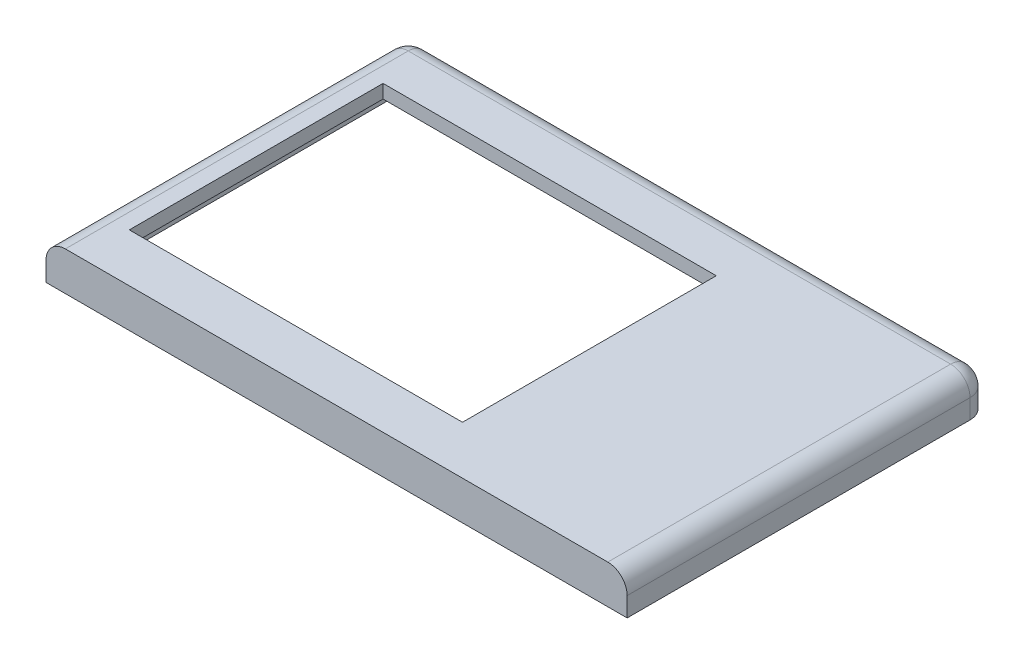
ISO-10303-21;
HEADER;
FILE_DESCRIPTION(('STEP AP214'),'2;1');
FILE_NAME('part.step','',(''),(''),'','','');
FILE_SCHEMA(('AUTOMOTIVE_DESIGN { 1 0 10303 214 1 1 1 1 }'));
ENDSEC;
DATA;
#1=APPLICATION_CONTEXT('core data for automotive mechanical design processes');
#2=APPLICATION_PROTOCOL_DEFINITION('international standard','automotive_design',2000,#1);
#3=PRODUCT_CONTEXT('',#1,'mechanical');
#4=PRODUCT('Part','Part','',(#3));
#5=PRODUCT_RELATED_PRODUCT_CATEGORY('part','',(#4));
#6=PRODUCT_DEFINITION_FORMATION('','',#4);
#7=PRODUCT_DEFINITION_CONTEXT('part definition',#1,'design');
#8=PRODUCT_DEFINITION('design','',#6,#7);
#9=PRODUCT_DEFINITION_SHAPE('','',#8);
#10=(LENGTH_UNIT() NAMED_UNIT(*) SI_UNIT(.MILLI.,.METRE.));
#11=(NAMED_UNIT(*) PLANE_ANGLE_UNIT() SI_UNIT($,.RADIAN.));
#12=(NAMED_UNIT(*) SI_UNIT($,.STERADIAN.) SOLID_ANGLE_UNIT());
#13=UNCERTAINTY_MEASURE_WITH_UNIT(LENGTH_MEASURE(1.E-05),#10,'distance_accuracy_value','');
#14=(GEOMETRIC_REPRESENTATION_CONTEXT(3) GLOBAL_UNCERTAINTY_ASSIGNED_CONTEXT((#13)) GLOBAL_UNIT_ASSIGNED_CONTEXT((#10,
#11,#12)) REPRESENTATION_CONTEXT('',''));
#15=CARTESIAN_POINT('',(0.,0.,0.));
#16=DIRECTION('',(0.,0.,1.));
#17=DIRECTION('',(1.,0.,0.));
#18=AXIS2_PLACEMENT_3D('',#15,#16,#17);
#19=CARTESIAN_POINT('',(0.,0.,0.));
#20=DIRECTION('',(0.,-1.,0.));
#21=DIRECTION('',(0.,0.,-1.));
#22=AXIS2_PLACEMENT_3D('',#19,#20,#21);
#23=PLANE('',#22);
#24=DIRECTION('',(1.,0.,0.));
#25=VECTOR('',#24,1.);
#26=CARTESIAN_POINT('',(-78.2626785631851,0.,-31.9813008786177));
#27=LINE('',#26,#25);
#28=CARTESIAN_POINT('',(-68.2626785631851,0.,-31.9813008786177));
#29=VERTEX_POINT('',#28);
#30=CARTESIAN_POINT('',(211.737321436815,0.,-31.9813008786177));
#31=VERTEX_POINT('',#30);
#32=EDGE_CURVE('E258',#29,#31,#27,.T.);
#33=ORIENTED_EDGE('',*,*,#32,.T.);
#34=CARTESIAN_POINT('',(211.737321436815,0.,-21.9813008786177));
#35=DIRECTION('',(0.,-1.,0.));
#36=DIRECTION('',(0.,0.,-1.));
#37=AXIS2_PLACEMENT_3D('',#34,#35,#36);
#38=CIRCLE('',#37,10.);
#39=CARTESIAN_POINT('',(221.737321436815,0.,-21.9813008786177));
#40=VERTEX_POINT('',#39);
#41=EDGE_CURVE('E288',#31,#40,#38,.T.);
#42=ORIENTED_EDGE('',*,*,#41,.T.);
#43=DIRECTION('',(0.,0.,1.));
#44=VECTOR('',#43,1.);
#45=CARTESIAN_POINT('',(221.737321436815,0.,-31.9813008786177));
#46=LINE('',#45,#44);
#47=CARTESIAN_POINT('',(221.737321436815,0.,155.018699121382));
#48=VERTEX_POINT('',#47);
#49=EDGE_CURVE('E256',#40,#48,#46,.T.);
#50=ORIENTED_EDGE('',*,*,#49,.T.);
#51=DIRECTION('',(1.,0.,0.));
#52=VECTOR('',#51,1.);
#53=CARTESIAN_POINT('',(-78.2626785631851,0.,155.018699121382));
#54=LINE('',#53,#52);
#55=CARTESIAN_POINT('',(-78.2626785631851,0.,155.018699121382));
#56=VERTEX_POINT('',#55);
#57=EDGE_CURVE('E233',#56,#48,#54,.T.);
#58=ORIENTED_EDGE('',*,*,#57,.F.);
#59=DIRECTION('',(0.,0.,1.));
#60=VECTOR('',#59,1.);
#61=CARTESIAN_POINT('',(-78.2626785631851,0.,-31.9813008786177));
#62=LINE('',#61,#60);
#63=CARTESIAN_POINT('',(-78.2626785631851,0.,-21.9813008786177));
#64=VERTEX_POINT('',#63);
#65=EDGE_CURVE('E253',#64,#56,#62,.T.);
#66=ORIENTED_EDGE('',*,*,#65,.F.);
#67=CARTESIAN_POINT('',(-68.2626785631851,0.,-21.9813008786177));
#68=DIRECTION('',(0.,-1.,0.));
#69=DIRECTION('',(0.,0.,-1.));
#70=AXIS2_PLACEMENT_3D('',#67,#68,#69);
#71=CIRCLE('',#70,10.);
#72=EDGE_CURVE('E286',#64,#29,#71,.T.);
#73=ORIENTED_EDGE('',*,*,#72,.T.);
#74=EDGE_LOOP('',(#33,#42,#50,#58,#66,#73));
#75=FACE_BOUND('',#74,.T.);
#76=DIRECTION('',(0.,0.,1.));
#77=VECTOR('',#76,1.);
#78=CARTESIAN_POINT('',(-71.2626785631851,0.,0.));
#79=LINE('',#78,#77);
#80=CARTESIAN_POINT('',(-71.2626785631851,0.,-24.9813008786177));
#81=VERTEX_POINT('',#80);
#82=CARTESIAN_POINT('',(-71.2626785631851,0.,148.018699121382));
#83=VERTEX_POINT('',#82);
#84=EDGE_CURVE('E217',#81,#83,#79,.T.);
#85=ORIENTED_EDGE('',*,*,#84,.T.);
#86=DIRECTION('',(1.,0.,0.));
#87=VECTOR('',#86,1.);
#88=CARTESIAN_POINT('',(0.,0.,148.018699121382));
#89=LINE('',#88,#87);
#90=CARTESIAN_POINT('',(214.737321436815,0.,148.018699121382));
#91=VERTEX_POINT('',#90);
#92=EDGE_CURVE('E201',#83,#91,#89,.T.);
#93=ORIENTED_EDGE('',*,*,#92,.T.);
#94=DIRECTION('',(0.,0.,1.));
#95=VECTOR('',#94,1.);
#96=CARTESIAN_POINT('',(214.737321436815,0.,0.));
#97=LINE('',#96,#95);
#98=CARTESIAN_POINT('',(214.737321436815,0.,-24.9813008786177));
#99=VERTEX_POINT('',#98);
#100=EDGE_CURVE('E242',#99,#91,#97,.T.);
#101=ORIENTED_EDGE('',*,*,#100,.F.);
#102=DIRECTION('',(1.,0.,0.));
#103=VECTOR('',#102,1.);
#104=CARTESIAN_POINT('',(0.,0.,-24.9813008786177));
#105=LINE('',#104,#103);
#106=EDGE_CURVE('E245',#81,#99,#105,.T.);
#107=ORIENTED_EDGE('',*,*,#106,.F.);
#108=EDGE_LOOP('',(#85,#93,#101,#107));
#109=FACE_BOUND('',#108,.T.);
#110=ADVANCED_FACE('F35',(#75,#109),#23,.T.);
#111=CARTESIAN_POINT('',(-78.2626785631851,20.,155.018699121382));
#112=DIRECTION('',(0.,0.,-1.));
#113=DIRECTION('',(-1.,0.,0.));
#114=AXIS2_PLACEMENT_3D('',#111,#112,#113);
#115=PLANE('',#114);
#116=DIRECTION('',(0.,-1.,0.));
#117=VECTOR('',#116,1.);
#118=CARTESIAN_POINT('',(221.737321436815,20.,155.018699121382));
#119=LINE('',#118,#117);
#120=CARTESIAN_POINT('',(221.737321436815,10.,155.018699121382));
#121=VERTEX_POINT('',#120);
#122=EDGE_CURVE('E264',#121,#48,#119,.T.);
#123=ORIENTED_EDGE('',*,*,#122,.F.);
#124=CARTESIAN_POINT('',(211.737321436815,10.,155.018699121382));
#125=DIRECTION('',(0.,0.,-1.));
#126=DIRECTION('',(-1.,0.,0.));
#127=AXIS2_PLACEMENT_3D('',#124,#125,#126);
#128=CIRCLE('',#127,10.);
#129=CARTESIAN_POINT('',(211.737321436815,20.,155.018699121382));
#130=VERTEX_POINT('',#129);
#131=EDGE_CURVE('E275',#121,#130,#128,.F.);
#132=ORIENTED_EDGE('',*,*,#131,.T.);
#133=DIRECTION('',(1.,0.,0.));
#134=VECTOR('',#133,1.);
#135=CARTESIAN_POINT('',(-78.2626785631851,20.,155.018699121382));
#136=LINE('',#135,#134);
#137=CARTESIAN_POINT('',(-68.2626785631851,20.,155.018699121382));
#138=VERTEX_POINT('',#137);
#139=EDGE_CURVE('E249',#138,#130,#136,.T.);
#140=ORIENTED_EDGE('',*,*,#139,.F.);
#141=CARTESIAN_POINT('',(-68.2626785631851,10.,155.018699121382));
#142=DIRECTION('',(0.,0.,-1.));
#143=DIRECTION('',(-1.,0.,0.));
#144=AXIS2_PLACEMENT_3D('',#141,#142,#143);
#145=CIRCLE('',#144,10.);
#146=CARTESIAN_POINT('',(-78.2626785631851,10.,155.018699121382));
#147=VERTEX_POINT('',#146);
#148=EDGE_CURVE('E269',#138,#147,#145,.F.);
#149=ORIENTED_EDGE('',*,*,#148,.T.);
#150=DIRECTION('',(0.,-1.,0.));
#151=VECTOR('',#150,1.);
#152=CARTESIAN_POINT('',(-78.2626785631851,20.,155.018699121382));
#153=LINE('',#152,#151);
#154=EDGE_CURVE('E252',#147,#56,#153,.T.);
#155=ORIENTED_EDGE('',*,*,#154,.T.);
#156=ORIENTED_EDGE('',*,*,#57,.T.);
#157=EDGE_LOOP('',(#123,#132,#140,#149,#155,#156));
#158=FACE_BOUND('',#157,.T.);
#159=ADVANCED_FACE('F325',(#158),#115,.F.);
#160=CARTESIAN_POINT('',(221.737321436815,20.,-31.9813008786177));
#161=DIRECTION('',(1.,0.,0.));
#162=DIRECTION('',(0.,0.,-1.));
#163=AXIS2_PLACEMENT_3D('',#160,#161,#162);
#164=PLANE('',#163);
#165=ORIENTED_EDGE('',*,*,#49,.F.);
#166=DIRECTION('',(0.,-1.,0.));
#167=VECTOR('',#166,1.);
#168=CARTESIAN_POINT('',(221.737321436815,20.,-21.9813008786177));
#169=LINE('',#168,#167);
#170=CARTESIAN_POINT('',(221.737321436815,10.,-21.9813008786177));
#171=VERTEX_POINT('',#170);
#172=EDGE_CURVE('E290',#40,#171,#169,.F.);
#173=ORIENTED_EDGE('',*,*,#172,.T.);
#174=DIRECTION('',(0.,0.,1.));
#175=VECTOR('',#174,1.);
#176=CARTESIAN_POINT('',(221.737321436815,10.,155.018699121382));
#177=LINE('',#176,#175);
#178=EDGE_CURVE('E273',#171,#121,#177,.T.);
#179=ORIENTED_EDGE('',*,*,#178,.T.);
#180=ORIENTED_EDGE('',*,*,#122,.T.);
#181=EDGE_LOOP('',(#165,#173,#179,#180));
#182=FACE_BOUND('',#181,.T.);
#183=ADVANCED_FACE('F347',(#182),#164,.T.);
#184=CARTESIAN_POINT('',(-78.2626785631851,20.,-31.9813008786177));
#185=DIRECTION('',(0.,0.,-1.));
#186=DIRECTION('',(-1.,0.,0.));
#187=AXIS2_PLACEMENT_3D('',#184,#185,#186);
#188=PLANE('',#187);
#189=DIRECTION('',(1.,0.,0.));
#190=VECTOR('',#189,1.);
#191=CARTESIAN_POINT('',(211.737321436815,10.,-31.9813008786177));
#192=LINE('',#191,#190);
#193=CARTESIAN_POINT('',(-68.2626785631851,10.,-31.9813008786177));
#194=VERTEX_POINT('',#193);
#195=CARTESIAN_POINT('',(211.737321436815,10.,-31.9813008786177));
#196=VERTEX_POINT('',#195);
#197=EDGE_CURVE('E281',#194,#196,#192,.T.);
#198=ORIENTED_EDGE('',*,*,#197,.T.);
#199=DIRECTION('',(0.,-1.,0.));
#200=VECTOR('',#199,1.);
#201=CARTESIAN_POINT('',(211.737321436815,20.,-31.9813008786177));
#202=LINE('',#201,#200);
#203=EDGE_CURVE('E283',#196,#31,#202,.T.);
#204=ORIENTED_EDGE('',*,*,#203,.T.);
#205=ORIENTED_EDGE('',*,*,#32,.F.);
#206=DIRECTION('',(0.,-1.,0.));
#207=VECTOR('',#206,1.);
#208=CARTESIAN_POINT('',(-68.2626785631851,10.,-31.9813008786177));
#209=LINE('',#208,#207);
#210=EDGE_CURVE('E279',#29,#194,#209,.F.);
#211=ORIENTED_EDGE('',*,*,#210,.T.);
#212=EDGE_LOOP('',(#198,#204,#205,#211));
#213=FACE_BOUND('',#212,.T.);
#214=ADVANCED_FACE('F345',(#213),#188,.T.);
#215=CARTESIAN_POINT('',(-78.2626785631851,20.,-31.9813008786177));
#216=DIRECTION('',(1.,0.,0.));
#217=DIRECTION('',(0.,0.,-1.));
#218=AXIS2_PLACEMENT_3D('',#215,#216,#217);
#219=PLANE('',#218);
#220=DIRECTION('',(0.,0.,1.));
#221=VECTOR('',#220,1.);
#222=CARTESIAN_POINT('',(-78.2626785631851,10.,-31.9813008786177));
#223=LINE('',#222,#221);
#224=CARTESIAN_POINT('',(-78.2626785631851,10.,-21.9813008786177));
#225=VERTEX_POINT('',#224);
#226=EDGE_CURVE('E271',#147,#225,#223,.F.);
#227=ORIENTED_EDGE('',*,*,#226,.T.);
#228=DIRECTION('',(0.,-1.,0.));
#229=VECTOR('',#228,1.);
#230=CARTESIAN_POINT('',(-78.2626785631851,0.,-21.9813008786177));
#231=LINE('',#230,#229);
#232=EDGE_CURVE('E11',#225,#64,#231,.T.);
#233=ORIENTED_EDGE('',*,*,#232,.T.);
#234=ORIENTED_EDGE('',*,*,#65,.T.);
#235=ORIENTED_EDGE('',*,*,#154,.F.);
#236=EDGE_LOOP('',(#227,#233,#234,#235));
#237=FACE_BOUND('',#236,.T.);
#238=ADVANCED_FACE('F316',(#237),#219,.F.);
#239=CARTESIAN_POINT('',(0.,20.,0.));
#240=DIRECTION('',(0.,-1.,0.));
#241=DIRECTION('',(0.,0.,-1.));
#242=AXIS2_PLACEMENT_3D('',#239,#240,#241);
#243=PLANE('',#242);
#244=DIRECTION('',(1.,0.,0.));
#245=VECTOR('',#244,1.);
#246=CARTESIAN_POINT('',(-60.2626785631851,20.,130.018699121382));
#247=LINE('',#246,#245);
#248=CARTESIAN_POINT('',(-60.2626785631851,20.,130.018699121382));
#249=VERTEX_POINT('',#248);
#250=CARTESIAN_POINT('',(111.737321436815,20.,130.018699121382));
#251=VERTEX_POINT('',#250);
#252=EDGE_CURVE('E195',#249,#251,#247,.T.);
#253=ORIENTED_EDGE('',*,*,#252,.F.);
#254=DIRECTION('',(0.,0.,1.));
#255=VECTOR('',#254,1.);
#256=CARTESIAN_POINT('',(-60.2626785631851,20.,-0.981300878617704));
#257=LINE('',#256,#255);
#258=CARTESIAN_POINT('',(-60.2626785631851,20.,-0.981300878617704));
#259=VERTEX_POINT('',#258);
#260=EDGE_CURVE('E169',#259,#249,#257,.T.);
#261=ORIENTED_EDGE('',*,*,#260,.F.);
#262=DIRECTION('',(1.,0.,0.));
#263=VECTOR('',#262,1.);
#264=CARTESIAN_POINT('',(-60.2626785631851,20.,-0.981300878617704));
#265=LINE('',#264,#263);
#266=CARTESIAN_POINT('',(111.737321436815,20.,-0.981300878617704));
#267=VERTEX_POINT('',#266);
#268=EDGE_CURVE('E186',#259,#267,#265,.T.);
#269=ORIENTED_EDGE('',*,*,#268,.T.);
#270=DIRECTION('',(0.,0.,1.));
#271=VECTOR('',#270,1.);
#272=CARTESIAN_POINT('',(111.737321436815,20.,-0.981300878617704));
#273=LINE('',#272,#271);
#274=EDGE_CURVE('E189',#267,#251,#273,.T.);
#275=ORIENTED_EDGE('',*,*,#274,.T.);
#276=EDGE_LOOP('',(#253,#261,#269,#275));
#277=FACE_BOUND('',#276,.T.);
#278=DIRECTION('',(0.,0.,1.));
#279=VECTOR('',#278,1.);
#280=CARTESIAN_POINT('',(211.737321436815,20.,-31.9813008786177));
#281=LINE('',#280,#279);
#282=CARTESIAN_POINT('',(211.737321436815,20.,-21.9813008786177));
#283=VERTEX_POINT('',#282);
#284=EDGE_CURVE('E277',#130,#283,#281,.F.);
#285=ORIENTED_EDGE('',*,*,#284,.T.);
#286=DIRECTION('',(1.,0.,0.));
#287=VECTOR('',#286,1.);
#288=CARTESIAN_POINT('',(-68.2626785631851,20.,-21.9813008786177));
#289=LINE('',#288,#287);
#290=CARTESIAN_POINT('',(-68.2626785631851,20.,-21.9813008786177));
#291=VERTEX_POINT('',#290);
#292=EDGE_CURVE('E59',#283,#291,#289,.F.);
#293=ORIENTED_EDGE('',*,*,#292,.T.);
#294=DIRECTION('',(0.,0.,1.));
#295=VECTOR('',#294,1.);
#296=CARTESIAN_POINT('',(-68.2626785631851,20.,0.));
#297=LINE('',#296,#295);
#298=EDGE_CURVE('E267',#291,#138,#297,.T.);
#299=ORIENTED_EDGE('',*,*,#298,.T.);
#300=ORIENTED_EDGE('',*,*,#139,.T.);
#301=EDGE_LOOP('',(#285,#293,#299,#300));
#302=FACE_BOUND('',#301,.T.);
#303=ADVANCED_FACE('F331',(#277,#302),#243,.F.);
#304=CARTESIAN_POINT('',(-68.2626785631851,10.,0.));
#305=DIRECTION('',(0.,0.,1.));
#306=DIRECTION('',(1.,0.,0.));
#307=AXIS2_PLACEMENT_3D('',#304,#305,#306);
#308=CYLINDRICAL_SURFACE('',#307,10.);
#309=ORIENTED_EDGE('',*,*,#298,.F.);
#310=CARTESIAN_POINT('',(-68.2626785631851,10.,-21.9813008786177));
#311=DIRECTION('',(0.,0.,1.));
#312=DIRECTION('',(1.,0.,0.));
#313=AXIS2_PLACEMENT_3D('',#310,#311,#312);
#314=CIRCLE('',#313,10.);
#315=EDGE_CURVE('E44',#291,#225,#314,.T.);
#316=ORIENTED_EDGE('',*,*,#315,.T.);
#317=ORIENTED_EDGE('',*,*,#226,.F.);
#318=ORIENTED_EDGE('',*,*,#148,.F.);
#319=EDGE_LOOP('',(#309,#316,#317,#318));
#320=FACE_BOUND('',#319,.T.);
#321=ADVANCED_FACE('F328',(#320),#308,.T.);
#322=CARTESIAN_POINT('',(211.737321436815,10.,-31.9813008786177));
#323=DIRECTION('',(0.,0.,-1.));
#324=DIRECTION('',(-1.,0.,0.));
#325=AXIS2_PLACEMENT_3D('',#322,#323,#324);
#326=CYLINDRICAL_SURFACE('',#325,10.);
#327=ORIENTED_EDGE('',*,*,#178,.F.);
#328=CARTESIAN_POINT('',(211.737321436815,10.,-21.9813008786177));
#329=DIRECTION('',(0.,0.,-1.));
#330=DIRECTION('',(-1.,0.,0.));
#331=AXIS2_PLACEMENT_3D('',#328,#329,#330);
#332=CIRCLE('',#331,10.);
#333=EDGE_CURVE('E292',#171,#283,#332,.F.);
#334=ORIENTED_EDGE('',*,*,#333,.T.);
#335=ORIENTED_EDGE('',*,*,#284,.F.);
#336=ORIENTED_EDGE('',*,*,#131,.F.);
#337=EDGE_LOOP('',(#327,#334,#335,#336));
#338=FACE_BOUND('',#337,.T.);
#339=ADVANCED_FACE('F334',(#338),#326,.T.);
#340=CARTESIAN_POINT('',(-78.2626785631851,20.,148.018699121382));
#341=DIRECTION('',(0.,0.,-1.));
#342=DIRECTION('',(-1.,0.,0.));
#343=AXIS2_PLACEMENT_3D('',#340,#341,#342);
#344=PLANE('',#343);
#345=DIRECTION('',(0.,-1.,0.));
#346=VECTOR('',#345,1.);
#347=CARTESIAN_POINT('',(214.737321436815,20.,148.018699121382));
#348=LINE('',#347,#346);
#349=CARTESIAN_POINT('',(214.737321436815,10.,148.018699121382));
#350=VERTEX_POINT('',#349);
#351=EDGE_CURVE('E205',#350,#91,#348,.T.);
#352=ORIENTED_EDGE('',*,*,#351,.T.);
#353=ORIENTED_EDGE('',*,*,#92,.F.);
#354=DIRECTION('',(0.,-1.,0.));
#355=VECTOR('',#354,1.);
#356=CARTESIAN_POINT('',(-71.2626785631851,20.,148.018699121382));
#357=LINE('',#356,#355);
#358=CARTESIAN_POINT('',(-71.2626785631851,10.,148.018699121382));
#359=VERTEX_POINT('',#358);
#360=EDGE_CURVE('E221',#359,#83,#357,.T.);
#361=ORIENTED_EDGE('',*,*,#360,.F.);
#362=CARTESIAN_POINT('',(-68.2626785631851,10.,148.018699121382));
#363=DIRECTION('',(0.,0.,-1.));
#364=DIRECTION('',(-1.,0.,0.));
#365=AXIS2_PLACEMENT_3D('',#362,#363,#364);
#366=CIRCLE('',#365,3.);
#367=CARTESIAN_POINT('',(-68.2626785631851,13.,148.018699121382));
#368=VERTEX_POINT('',#367);
#369=EDGE_CURVE('E218',#368,#359,#366,.F.);
#370=ORIENTED_EDGE('',*,*,#369,.F.);
#371=DIRECTION('',(1.,0.,0.));
#372=VECTOR('',#371,1.);
#373=CARTESIAN_POINT('',(0.,13.,148.018699121382));
#374=LINE('',#373,#372);
#375=CARTESIAN_POINT('',(211.737321436815,13.,148.018699121382));
#376=VERTEX_POINT('',#375);
#377=EDGE_CURVE('E213',#368,#376,#374,.T.);
#378=ORIENTED_EDGE('',*,*,#377,.T.);
#379=CARTESIAN_POINT('',(211.737321436815,10.,148.018699121382));
#380=DIRECTION('',(0.,0.,-1.));
#381=DIRECTION('',(-1.,0.,0.));
#382=AXIS2_PLACEMENT_3D('',#379,#380,#381);
#383=CIRCLE('',#382,3.);
#384=EDGE_CURVE('E209',#350,#376,#383,.F.);
#385=ORIENTED_EDGE('',*,*,#384,.F.);
#386=EDGE_LOOP('',(#352,#353,#361,#370,#378,#385));
#387=FACE_BOUND('',#386,.T.);
#388=ADVANCED_FACE('F392',(#387),#344,.T.);
#389=CARTESIAN_POINT('',(214.737321436815,20.,-31.9813008786177));
#390=DIRECTION('',(1.,0.,0.));
#391=DIRECTION('',(0.,0.,-1.));
#392=AXIS2_PLACEMENT_3D('',#389,#390,#391);
#393=PLANE('',#392);
#394=DIRECTION('',(0.,-1.,0.));
#395=VECTOR('',#394,1.);
#396=CARTESIAN_POINT('',(214.737321436815,20.,-24.9813008786177));
#397=LINE('',#396,#395);
#398=CARTESIAN_POINT('',(214.737321436815,10.,-24.9813008786177));
#399=VERTEX_POINT('',#398);
#400=EDGE_CURVE('E208',#399,#99,#397,.T.);
#401=ORIENTED_EDGE('',*,*,#400,.T.);
#402=ORIENTED_EDGE('',*,*,#100,.T.);
#403=ORIENTED_EDGE('',*,*,#351,.F.);
#404=DIRECTION('',(0.,0.,-1.));
#405=VECTOR('',#404,1.);
#406=CARTESIAN_POINT('',(214.737321436815,10.,-31.9813008786177));
#407=LINE('',#406,#405);
#408=EDGE_CURVE('E212',#399,#350,#407,.F.);
#409=ORIENTED_EDGE('',*,*,#408,.F.);
#410=EDGE_LOOP('',(#401,#402,#403,#409));
#411=FACE_BOUND('',#410,.T.);
#412=ADVANCED_FACE('F395',(#411),#393,.F.);
#413=CARTESIAN_POINT('',(-78.2626785631851,20.,-24.9813008786177));
#414=DIRECTION('',(0.,0.,-1.));
#415=DIRECTION('',(-1.,0.,0.));
#416=AXIS2_PLACEMENT_3D('',#413,#414,#415);
#417=PLANE('',#416);
#418=DIRECTION('',(1.,0.,0.));
#419=VECTOR('',#418,1.);
#420=CARTESIAN_POINT('',(0.,13.,-24.9813008786177));
#421=LINE('',#420,#419);
#422=CARTESIAN_POINT('',(-68.2626785631851,13.,-24.9813008786177));
#423=VERTEX_POINT('',#422);
#424=CARTESIAN_POINT('',(211.737321436815,13.,-24.9813008786177));
#425=VERTEX_POINT('',#424);
#426=EDGE_CURVE('E216',#423,#425,#421,.T.);
#427=ORIENTED_EDGE('',*,*,#426,.F.);
#428=CARTESIAN_POINT('',(-68.2626785631851,10.,-24.9813008786177));
#429=DIRECTION('',(0.,0.,-1.));
#430=DIRECTION('',(-1.,0.,0.));
#431=AXIS2_PLACEMENT_3D('',#428,#429,#430);
#432=CIRCLE('',#431,3.);
#433=CARTESIAN_POINT('',(-71.2626785631851,10.,-24.9813008786177));
#434=VERTEX_POINT('',#433);
#435=EDGE_CURVE('E228',#434,#423,#432,.T.);
#436=ORIENTED_EDGE('',*,*,#435,.F.);
#437=DIRECTION('',(0.,-1.,0.));
#438=VECTOR('',#437,1.);
#439=CARTESIAN_POINT('',(-71.2626785631851,20.,-24.9813008786177));
#440=LINE('',#439,#438);
#441=EDGE_CURVE('E223',#434,#81,#440,.T.);
#442=ORIENTED_EDGE('',*,*,#441,.T.);
#443=ORIENTED_EDGE('',*,*,#106,.T.);
#444=ORIENTED_EDGE('',*,*,#400,.F.);
#445=CARTESIAN_POINT('',(211.737321436815,10.,-24.9813008786177));
#446=DIRECTION('',(0.,0.,-1.));
#447=DIRECTION('',(-1.,0.,0.));
#448=AXIS2_PLACEMENT_3D('',#445,#446,#447);
#449=CIRCLE('',#448,3.);
#450=EDGE_CURVE('E231',#425,#399,#449,.T.);
#451=ORIENTED_EDGE('',*,*,#450,.F.);
#452=EDGE_LOOP('',(#427,#436,#442,#443,#444,#451));
#453=FACE_BOUND('',#452,.T.);
#454=ADVANCED_FACE('F399',(#453),#417,.F.);
#455=CARTESIAN_POINT('',(-71.2626785631851,20.,-31.9813008786177));
#456=DIRECTION('',(1.,0.,0.));
#457=DIRECTION('',(0.,0.,-1.));
#458=AXIS2_PLACEMENT_3D('',#455,#456,#457);
#459=PLANE('',#458);
#460=ORIENTED_EDGE('',*,*,#360,.T.);
#461=ORIENTED_EDGE('',*,*,#84,.F.);
#462=ORIENTED_EDGE('',*,*,#441,.F.);
#463=DIRECTION('',(0.,0.,-1.));
#464=VECTOR('',#463,1.);
#465=CARTESIAN_POINT('',(-71.2626785631851,10.,-31.9813008786177));
#466=LINE('',#465,#464);
#467=EDGE_CURVE('E220',#359,#434,#466,.T.);
#468=ORIENTED_EDGE('',*,*,#467,.F.);
#469=EDGE_LOOP('',(#460,#461,#462,#468));
#470=FACE_BOUND('',#469,.T.);
#471=ADVANCED_FACE('F403',(#470),#459,.T.);
#472=CARTESIAN_POINT('',(0.,13.,0.));
#473=DIRECTION('',(0.,-1.,0.));
#474=DIRECTION('',(0.,0.,-1.));
#475=AXIS2_PLACEMENT_3D('',#472,#473,#474);
#476=PLANE('',#475);
#477=DIRECTION('',(0.,0.,1.));
#478=VECTOR('',#477,1.);
#479=CARTESIAN_POINT('',(-60.2626785631851,13.,-0.981300878617704));
#480=LINE('',#479,#478);
#481=CARTESIAN_POINT('',(-60.2626785631851,13.,-0.981300878617704));
#482=VERTEX_POINT('',#481);
#483=CARTESIAN_POINT('',(-60.2626785631851,13.,130.018699121382));
#484=VERTEX_POINT('',#483);
#485=EDGE_CURVE('E166',#482,#484,#480,.T.);
#486=ORIENTED_EDGE('',*,*,#485,.T.);
#487=DIRECTION('',(1.,0.,0.));
#488=VECTOR('',#487,1.);
#489=CARTESIAN_POINT('',(-60.2626785631851,13.,130.018699121382));
#490=LINE('',#489,#488);
#491=CARTESIAN_POINT('',(111.737321436815,13.,130.018699121382));
#492=VERTEX_POINT('',#491);
#493=EDGE_CURVE('E177',#484,#492,#490,.T.);
#494=ORIENTED_EDGE('',*,*,#493,.T.);
#495=DIRECTION('',(0.,0.,1.));
#496=VECTOR('',#495,1.);
#497=CARTESIAN_POINT('',(111.737321436815,13.,-0.981300878617704));
#498=LINE('',#497,#496);
#499=CARTESIAN_POINT('',(111.737321436815,13.,-0.981300878617704));
#500=VERTEX_POINT('',#499);
#501=EDGE_CURVE('E182',#500,#492,#498,.T.);
#502=ORIENTED_EDGE('',*,*,#501,.F.);
#503=DIRECTION('',(1.,0.,0.));
#504=VECTOR('',#503,1.);
#505=CARTESIAN_POINT('',(-60.2626785631851,13.,-0.981300878617704));
#506=LINE('',#505,#504);
#507=EDGE_CURVE('E174',#482,#500,#506,.T.);
#508=ORIENTED_EDGE('',*,*,#507,.F.);
#509=EDGE_LOOP('',(#486,#494,#502,#508));
#510=FACE_BOUND('',#509,.T.);
#511=ORIENTED_EDGE('',*,*,#377,.F.);
#512=DIRECTION('',(0.,0.,-1.));
#513=VECTOR('',#512,1.);
#514=CARTESIAN_POINT('',(-68.2626785631851,13.,0.));
#515=LINE('',#514,#513);
#516=EDGE_CURVE('E207',#423,#368,#515,.F.);
#517=ORIENTED_EDGE('',*,*,#516,.F.);
#518=ORIENTED_EDGE('',*,*,#426,.T.);
#519=DIRECTION('',(0.,0.,-1.));
#520=VECTOR('',#519,1.);
#521=CARTESIAN_POINT('',(211.737321436815,13.,0.));
#522=LINE('',#521,#520);
#523=EDGE_CURVE('E211',#376,#425,#522,.T.);
#524=ORIENTED_EDGE('',*,*,#523,.F.);
#525=EDGE_LOOP('',(#511,#517,#518,#524));
#526=FACE_BOUND('',#525,.T.);
#527=ADVANCED_FACE('F184',(#510,#526),#476,.T.);
#528=CARTESIAN_POINT('',(-68.2626785631851,10.,0.));
#529=DIRECTION('',(0.,0.,1.));
#530=DIRECTION('',(1.,0.,0.));
#531=AXIS2_PLACEMENT_3D('',#528,#529,#530);
#532=CYLINDRICAL_SURFACE('',#531,3.);
#533=ORIENTED_EDGE('',*,*,#435,.T.);
#534=ORIENTED_EDGE('',*,*,#516,.T.);
#535=ORIENTED_EDGE('',*,*,#369,.T.);
#536=ORIENTED_EDGE('',*,*,#467,.T.);
#537=EDGE_LOOP('',(#533,#534,#535,#536));
#538=FACE_BOUND('',#537,.T.);
#539=ADVANCED_FACE('F410',(#538),#532,.F.);
#540=CARTESIAN_POINT('',(211.737321436815,10.,-31.9813008786177));
#541=DIRECTION('',(0.,0.,-1.));
#542=DIRECTION('',(-1.,0.,0.));
#543=AXIS2_PLACEMENT_3D('',#540,#541,#542);
#544=CYLINDRICAL_SURFACE('',#543,3.);
#545=ORIENTED_EDGE('',*,*,#450,.T.);
#546=ORIENTED_EDGE('',*,*,#408,.T.);
#547=ORIENTED_EDGE('',*,*,#384,.T.);
#548=ORIENTED_EDGE('',*,*,#523,.T.);
#549=EDGE_LOOP('',(#545,#546,#547,#548));
#550=FACE_BOUND('',#549,.T.);
#551=ADVANCED_FACE('F387',(#550),#544,.F.);
#552=CARTESIAN_POINT('',(-60.2626785631851,13.,-0.981300878617704));
#553=DIRECTION('',(-1.,0.,0.));
#554=DIRECTION('',(0.,0.,1.));
#555=AXIS2_PLACEMENT_3D('',#552,#553,#554);
#556=PLANE('',#555);
#557=ORIENTED_EDGE('',*,*,#260,.T.);
#558=DIRECTION('',(0.,1.,0.));
#559=VECTOR('',#558,1.);
#560=CARTESIAN_POINT('',(-60.2626785631851,13.,130.018699121382));
#561=LINE('',#560,#559);
#562=EDGE_CURVE('E162',#484,#249,#561,.T.);
#563=ORIENTED_EDGE('',*,*,#562,.F.);
#564=ORIENTED_EDGE('',*,*,#485,.F.);
#565=DIRECTION('',(0.,1.,0.));
#566=VECTOR('',#565,1.);
#567=CARTESIAN_POINT('',(-60.2626785631851,13.,-0.981300878617704));
#568=LINE('',#567,#566);
#569=EDGE_CURVE('E199',#482,#259,#568,.T.);
#570=ORIENTED_EDGE('',*,*,#569,.T.);
#571=EDGE_LOOP('',(#557,#563,#564,#570));
#572=FACE_BOUND('',#571,.T.);
#573=ADVANCED_FACE('F164',(#572),#556,.F.);
#574=CARTESIAN_POINT('',(-60.2626785631851,13.,-0.981300878617704));
#575=DIRECTION('',(0.,0.,1.));
#576=DIRECTION('',(1.,0.,0.));
#577=AXIS2_PLACEMENT_3D('',#574,#575,#576);
#578=PLANE('',#577);
#579=ORIENTED_EDGE('',*,*,#268,.F.);
#580=ORIENTED_EDGE('',*,*,#569,.F.);
#581=ORIENTED_EDGE('',*,*,#507,.T.);
#582=DIRECTION('',(0.,1.,0.));
#583=VECTOR('',#582,1.);
#584=CARTESIAN_POINT('',(111.737321436815,13.,-0.981300878617704));
#585=LINE('',#584,#583);
#586=EDGE_CURVE('E202',#500,#267,#585,.T.);
#587=ORIENTED_EDGE('',*,*,#586,.T.);
#588=EDGE_LOOP('',(#579,#580,#581,#587));
#589=FACE_BOUND('',#588,.T.);
#590=ADVANCED_FACE('F379',(#589),#578,.T.);
#591=CARTESIAN_POINT('',(111.737321436815,13.,-0.981300878617704));
#592=DIRECTION('',(-1.,0.,0.));
#593=DIRECTION('',(0.,0.,1.));
#594=AXIS2_PLACEMENT_3D('',#591,#592,#593);
#595=PLANE('',#594);
#596=ORIENTED_EDGE('',*,*,#274,.F.);
#597=ORIENTED_EDGE('',*,*,#586,.F.);
#598=ORIENTED_EDGE('',*,*,#501,.T.);
#599=DIRECTION('',(0.,1.,0.));
#600=VECTOR('',#599,1.);
#601=CARTESIAN_POINT('',(111.737321436815,13.,130.018699121382));
#602=LINE('',#601,#600);
#603=EDGE_CURVE('E173',#492,#251,#602,.T.);
#604=ORIENTED_EDGE('',*,*,#603,.T.);
#605=EDGE_LOOP('',(#596,#597,#598,#604));
#606=FACE_BOUND('',#605,.T.);
#607=ADVANCED_FACE('F377',(#606),#595,.T.);
#608=CARTESIAN_POINT('',(-60.2626785631851,13.,130.018699121382));
#609=DIRECTION('',(0.,0.,1.));
#610=DIRECTION('',(1.,0.,0.));
#611=AXIS2_PLACEMENT_3D('',#608,#609,#610);
#612=PLANE('',#611);
#613=ORIENTED_EDGE('',*,*,#252,.T.);
#614=ORIENTED_EDGE('',*,*,#603,.F.);
#615=ORIENTED_EDGE('',*,*,#493,.F.);
#616=ORIENTED_EDGE('',*,*,#562,.T.);
#617=EDGE_LOOP('',(#613,#614,#615,#616));
#618=FACE_BOUND('',#617,.T.);
#619=ADVANCED_FACE('F178',(#618),#612,.F.);
#620=CARTESIAN_POINT('',(-68.2626785631851,20.,-21.9813008786177));
#621=DIRECTION('',(0.,1.,0.));
#622=DIRECTION('',(0.,0.,1.));
#623=AXIS2_PLACEMENT_3D('',#620,#621,#622);
#624=CYLINDRICAL_SURFACE('',#623,10.);
#625=ORIENTED_EDGE('',*,*,#72,.F.);
#626=ORIENTED_EDGE('',*,*,#232,.F.);
#627=CARTESIAN_POINT('',(-68.2626785631851,10.,-21.9813008786177));
#628=DIRECTION('',(0.,1.,0.));
#629=DIRECTION('',(0.,0.,1.));
#630=AXIS2_PLACEMENT_3D('',#627,#628,#629);
#631=CIRCLE('',#630,10.);
#632=EDGE_CURVE('E39',#194,#225,#631,.T.);
#633=ORIENTED_EDGE('',*,*,#632,.F.);
#634=ORIENTED_EDGE('',*,*,#210,.F.);
#635=EDGE_LOOP('',(#625,#626,#633,#634));
#636=FACE_BOUND('',#635,.T.);
#637=ADVANCED_FACE('F37',(#636),#624,.T.);
#638=CARTESIAN_POINT('',(-68.2626785631851,10.,-21.9813008786177));
#639=DIRECTION('',(0.,0.,-1.));
#640=DIRECTION('',(-1.,0.,0.));
#641=AXIS2_PLACEMENT_3D('',#638,#639,#640);
#642=SPHERICAL_SURFACE('',#641,10.);
#643=ORIENTED_EDGE('',*,*,#632,.T.);
#644=ORIENTED_EDGE('',*,*,#315,.F.);
#645=CARTESIAN_POINT('',(-68.2626785631851,10.,-21.9813008786177));
#646=DIRECTION('',(1.,0.,0.));
#647=DIRECTION('',(0.,0.,-1.));
#648=AXIS2_PLACEMENT_3D('',#645,#646,#647);
#649=CIRCLE('',#648,10.);
#650=EDGE_CURVE('E301',#194,#291,#649,.T.);
#651=ORIENTED_EDGE('',*,*,#650,.F.);
#652=EDGE_LOOP('',(#643,#644,#651));
#653=FACE_BOUND('',#652,.T.);
#654=ADVANCED_FACE('F309',(#653),#642,.T.);
#655=CARTESIAN_POINT('',(-78.2626785631851,10.,-21.9813008786177));
#656=DIRECTION('',(-1.,0.,0.));
#657=DIRECTION('',(0.,0.,1.));
#658=AXIS2_PLACEMENT_3D('',#655,#656,#657);
#659=CYLINDRICAL_SURFACE('',#658,10.);
#660=ORIENTED_EDGE('',*,*,#650,.T.);
#661=ORIENTED_EDGE('',*,*,#292,.F.);
#662=CARTESIAN_POINT('',(211.737321436815,10.,-21.9813008786177));
#663=DIRECTION('',(1.,0.,0.));
#664=DIRECTION('',(0.,0.,-1.));
#665=AXIS2_PLACEMENT_3D('',#662,#663,#664);
#666=CIRCLE('',#665,10.);
#667=EDGE_CURVE('E299',#196,#283,#666,.T.);
#668=ORIENTED_EDGE('',*,*,#667,.F.);
#669=ORIENTED_EDGE('',*,*,#197,.F.);
#670=EDGE_LOOP('',(#660,#661,#668,#669));
#671=FACE_BOUND('',#670,.T.);
#672=ADVANCED_FACE('F471',(#671),#659,.T.);
#673=CARTESIAN_POINT('',(211.737321436815,10.,-21.9813008786177));
#674=DIRECTION('',(0.,0.,-1.));
#675=DIRECTION('',(-1.,0.,0.));
#676=AXIS2_PLACEMENT_3D('',#673,#674,#675);
#677=SPHERICAL_SURFACE('',#676,10.);
#678=ORIENTED_EDGE('',*,*,#667,.T.);
#679=ORIENTED_EDGE('',*,*,#333,.F.);
#680=CARTESIAN_POINT('',(211.737321436815,10.,-21.9813008786177));
#681=DIRECTION('',(0.,-1.,0.));
#682=DIRECTION('',(0.,0.,-1.));
#683=AXIS2_PLACEMENT_3D('',#680,#681,#682);
#684=CIRCLE('',#683,10.);
#685=EDGE_CURVE('E296',#196,#171,#684,.T.);
#686=ORIENTED_EDGE('',*,*,#685,.F.);
#687=EDGE_LOOP('',(#678,#679,#686));
#688=FACE_BOUND('',#687,.T.);
#689=ADVANCED_FACE('F338',(#688),#677,.T.);
#690=CARTESIAN_POINT('',(211.737321436815,20.,-21.9813008786177));
#691=DIRECTION('',(0.,-1.,0.));
#692=DIRECTION('',(0.,0.,-1.));
#693=AXIS2_PLACEMENT_3D('',#690,#691,#692);
#694=CYLINDRICAL_SURFACE('',#693,10.);
#695=ORIENTED_EDGE('',*,*,#685,.T.);
#696=ORIENTED_EDGE('',*,*,#172,.F.);
#697=ORIENTED_EDGE('',*,*,#41,.F.);
#698=ORIENTED_EDGE('',*,*,#203,.F.);
#699=EDGE_LOOP('',(#695,#696,#697,#698));
#700=FACE_BOUND('',#699,.T.);
#701=ADVANCED_FACE('F343',(#700),#694,.T.);
#702=CLOSED_SHELL('',(#110,#159,#183,#214,#238,#303,#321,#339,#388,#412,#454,#471,#527,#539,
#551,#573,#590,#607,#619,#637,#654,#672,#689,#701));
#703=MANIFOLD_SOLID_BREP('B2',#702);
#704=ADVANCED_BREP_SHAPE_REPRESENTATION('',(#18,#703),#14);
#705=SHAPE_DEFINITION_REPRESENTATION(#9,#704);
ENDSEC;
END-ISO-10303-21;
